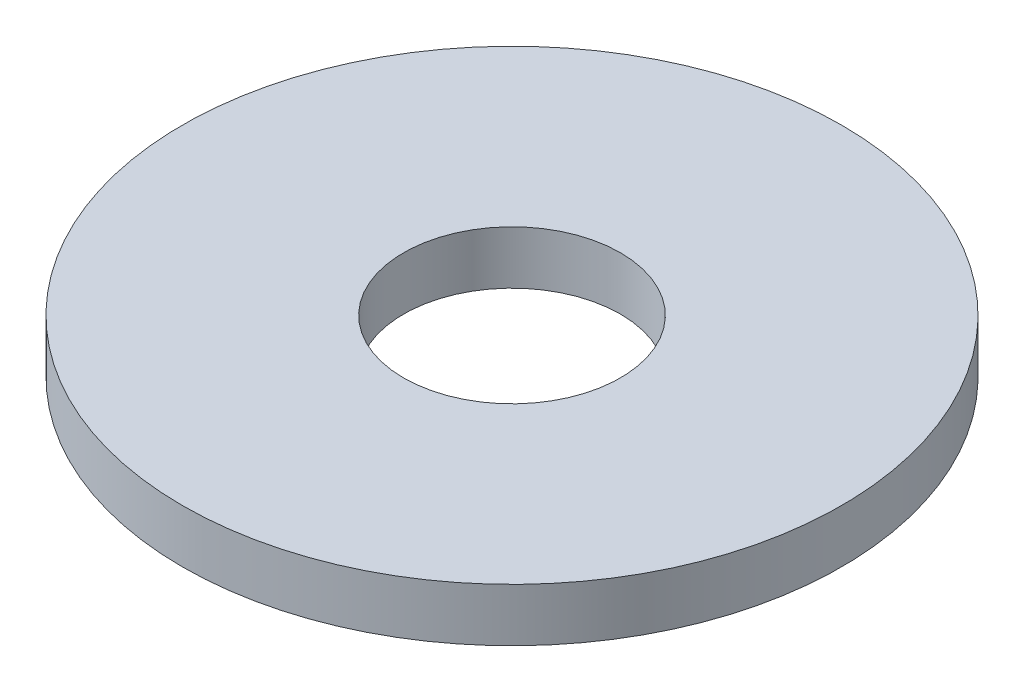
ISO-10303-21;
HEADER;
FILE_DESCRIPTION(('STEP AP214'),'2;1');
FILE_NAME('part.step','',(''),(''),'','','');
FILE_SCHEMA(('AUTOMOTIVE_DESIGN { 1 0 10303 214 1 1 1 1 }'));
ENDSEC;
DATA;
#1=APPLICATION_CONTEXT('core data for automotive mechanical design processes');
#2=APPLICATION_PROTOCOL_DEFINITION('international standard','automotive_design',2000,#1);
#3=PRODUCT_CONTEXT('',#1,'mechanical');
#4=PRODUCT('Part','Part','',(#3));
#5=PRODUCT_RELATED_PRODUCT_CATEGORY('part','',(#4));
#6=PRODUCT_DEFINITION_FORMATION('','',#4);
#7=PRODUCT_DEFINITION_CONTEXT('part definition',#1,'design');
#8=PRODUCT_DEFINITION('design','',#6,#7);
#9=PRODUCT_DEFINITION_SHAPE('','',#8);
#10=(LENGTH_UNIT() NAMED_UNIT(*) SI_UNIT(.MILLI.,.METRE.));
#11=(NAMED_UNIT(*) PLANE_ANGLE_UNIT() SI_UNIT($,.RADIAN.));
#12=(NAMED_UNIT(*) SI_UNIT($,.STERADIAN.) SOLID_ANGLE_UNIT());
#13=UNCERTAINTY_MEASURE_WITH_UNIT(LENGTH_MEASURE(1.E-05),#10,'distance_accuracy_value','');
#14=(GEOMETRIC_REPRESENTATION_CONTEXT(3) GLOBAL_UNCERTAINTY_ASSIGNED_CONTEXT((#13)) GLOBAL_UNIT_ASSIGNED_CONTEXT((#10,
#11,#12)) REPRESENTATION_CONTEXT('',''));
#15=CARTESIAN_POINT('',(0.,0.,0.));
#16=DIRECTION('',(0.,0.,1.));
#17=DIRECTION('',(1.,0.,0.));
#18=AXIS2_PLACEMENT_3D('',#15,#16,#17);
#19=CARTESIAN_POINT('',(0.,5.,0.));
#20=DIRECTION('',(0.,1.,0.));
#21=DIRECTION('',(0.,0.,1.));
#22=AXIS2_PLACEMENT_3D('',#19,#20,#21);
#23=PLANE('',#22);
#24=CARTESIAN_POINT('',(0.,5.,0.));
#25=DIRECTION('',(0.,1.,0.));
#26=DIRECTION('',(0.,0.,1.));
#27=AXIS2_PLACEMENT_3D('',#24,#25,#26);
#28=CIRCLE('',#27,31.);
#29=CARTESIAN_POINT('',(0.,5.,31.));
#30=VERTEX_POINT('',#29);
#31=EDGE_CURVE('E10',#30,#30,#28,.T.);
#32=ORIENTED_EDGE('',*,*,#31,.T.);
#33=EDGE_LOOP('',(#32));
#34=FACE_BOUND('',#33,.T.);
#35=CARTESIAN_POINT('',(0.,5.,0.));
#36=DIRECTION('',(0.,1.,0.));
#37=DIRECTION('',(0.,0.,1.));
#38=AXIS2_PLACEMENT_3D('',#35,#36,#37);
#39=CIRCLE('',#38,10.2);
#40=CARTESIAN_POINT('',(0.,5.,10.2));
#41=VERTEX_POINT('',#40);
#42=EDGE_CURVE('E48',#41,#41,#39,.T.);
#43=ORIENTED_EDGE('',*,*,#42,.F.);
#44=EDGE_LOOP('',(#43));
#45=FACE_BOUND('',#44,.T.);
#46=ADVANCED_FACE('F40',(#34,#45),#23,.T.);
#47=CARTESIAN_POINT('',(0.,0.,0.));
#48=DIRECTION('',(0.,1.,0.));
#49=DIRECTION('',(0.,0.,1.));
#50=AXIS2_PLACEMENT_3D('',#47,#48,#49);
#51=PLANE('',#50);
#52=CARTESIAN_POINT('',(0.,0.,0.));
#53=DIRECTION('',(0.,1.,0.));
#54=DIRECTION('',(0.,0.,1.));
#55=AXIS2_PLACEMENT_3D('',#52,#53,#54);
#56=CIRCLE('',#55,31.);
#57=CARTESIAN_POINT('',(0.,0.,31.));
#58=VERTEX_POINT('',#57);
#59=EDGE_CURVE('E41',#58,#58,#56,.T.);
#60=ORIENTED_EDGE('',*,*,#59,.F.);
#61=EDGE_LOOP('',(#60));
#62=FACE_BOUND('',#61,.T.);
#63=CARTESIAN_POINT('',(0.,0.,0.));
#64=DIRECTION('',(0.,1.,0.));
#65=DIRECTION('',(0.,0.,1.));
#66=AXIS2_PLACEMENT_3D('',#63,#64,#65);
#67=CIRCLE('',#66,10.2);
#68=CARTESIAN_POINT('',(0.,0.,10.2));
#69=VERTEX_POINT('',#68);
#70=EDGE_CURVE('E49',#69,#69,#67,.T.);
#71=ORIENTED_EDGE('',*,*,#70,.T.);
#72=EDGE_LOOP('',(#71));
#73=FACE_BOUND('',#72,.T.);
#74=ADVANCED_FACE('F58',(#62,#73),#51,.F.);
#75=CARTESIAN_POINT('',(0.,5.,0.));
#76=DIRECTION('',(0.,-1.,0.));
#77=DIRECTION('',(0.,0.,-1.));
#78=AXIS2_PLACEMENT_3D('',#75,#76,#77);
#79=CYLINDRICAL_SURFACE('',#78,31.);
#80=ORIENTED_EDGE('',*,*,#31,.F.);
#81=EDGE_LOOP('',(#80));
#82=FACE_BOUND('',#81,.T.);
#83=ORIENTED_EDGE('',*,*,#59,.T.);
#84=EDGE_LOOP('',(#83));
#85=FACE_BOUND('',#84,.T.);
#86=ADVANCED_FACE('F39',(#82,#85),#79,.T.);
#87=CARTESIAN_POINT('',(0.,5.,0.));
#88=DIRECTION('',(0.,-1.,0.));
#89=DIRECTION('',(0.,0.,-1.));
#90=AXIS2_PLACEMENT_3D('',#87,#88,#89);
#91=CYLINDRICAL_SURFACE('',#90,10.2);
#92=ORIENTED_EDGE('',*,*,#42,.T.);
#93=EDGE_LOOP('',(#92));
#94=FACE_BOUND('',#93,.T.);
#95=ORIENTED_EDGE('',*,*,#70,.F.);
#96=EDGE_LOOP('',(#95));
#97=FACE_BOUND('',#96,.T.);
#98=ADVANCED_FACE('F57',(#94,#97),#91,.F.);
#99=CLOSED_SHELL('',(#46,#74,#86,#98));
#100=MANIFOLD_SOLID_BREP('B2',#99);
#101=ADVANCED_BREP_SHAPE_REPRESENTATION('',(#18,#100),#14);
#102=SHAPE_DEFINITION_REPRESENTATION(#9,#101);
ENDSEC;
END-ISO-10303-21;
